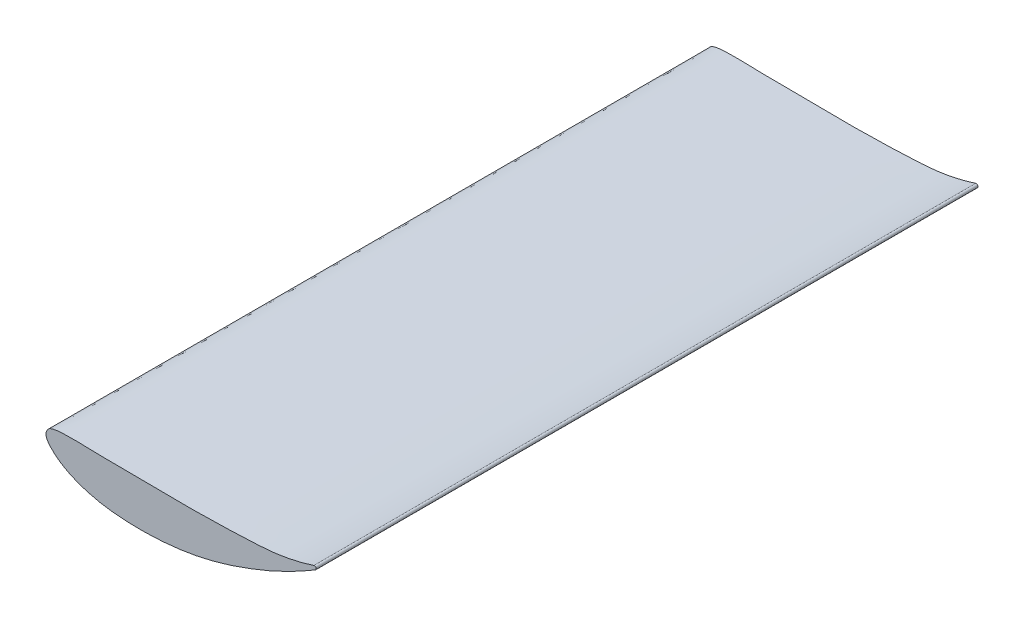
ISO-10303-21;
HEADER;
FILE_DESCRIPTION(('STEP AP214'),'2;1');
FILE_NAME('part.step','',(''),(''),'','','');
FILE_SCHEMA(('AUTOMOTIVE_DESIGN { 1 0 10303 214 1 1 1 1 }'));
ENDSEC;
DATA;
#1=APPLICATION_CONTEXT('core data for automotive mechanical design processes');
#2=APPLICATION_PROTOCOL_DEFINITION('international standard','automotive_design',2000,#1);
#3=PRODUCT_CONTEXT('',#1,'mechanical');
#4=PRODUCT('Part','Part','',(#3));
#5=PRODUCT_RELATED_PRODUCT_CATEGORY('part','',(#4));
#6=PRODUCT_DEFINITION_FORMATION('','',#4);
#7=PRODUCT_DEFINITION_CONTEXT('part definition',#1,'design');
#8=PRODUCT_DEFINITION('design','',#6,#7);
#9=PRODUCT_DEFINITION_SHAPE('','',#8);
#10=(LENGTH_UNIT() NAMED_UNIT(*) SI_UNIT(.MILLI.,.METRE.));
#11=(NAMED_UNIT(*) PLANE_ANGLE_UNIT() SI_UNIT($,.RADIAN.));
#12=(NAMED_UNIT(*) SI_UNIT($,.STERADIAN.) SOLID_ANGLE_UNIT());
#13=UNCERTAINTY_MEASURE_WITH_UNIT(LENGTH_MEASURE(1.E-05),#10,'distance_accuracy_value','');
#14=(GEOMETRIC_REPRESENTATION_CONTEXT(3) GLOBAL_UNCERTAINTY_ASSIGNED_CONTEXT((#13)) GLOBAL_UNIT_ASSIGNED_CONTEXT((#10,
#11,#12)) REPRESENTATION_CONTEXT('',''));
#15=CARTESIAN_POINT('',(0.,0.,0.));
#16=DIRECTION('',(0.,0.,1.));
#17=DIRECTION('',(1.,0.,0.));
#18=AXIS2_PLACEMENT_3D('',#15,#16,#17);
#19=CARTESIAN_POINT('',(441.90503658956,24.941772715321,-450.));
#20=DIRECTION('',(0.,0.,1.));
#21=DIRECTION('',(1.,0.,0.));
#22=AXIS2_PLACEMENT_3D('',#19,#20,#21);
#23=CYLINDRICAL_SURFACE('',#22,2.41324609299518);
#24=DIRECTION('',(0.,0.,1.));
#25=VECTOR('',#24,1.);
#26=CARTESIAN_POINT('',(441.121202429271,27.2241751151008,-450.));
#27=LINE('',#26,#25);
#28=CARTESIAN_POINT('',(441.121202429271,27.2241751151008,-450.));
#29=VERTEX_POINT('',#28);
#30=CARTESIAN_POINT('',(441.121202429271,27.2241751151008,450.));
#31=VERTEX_POINT('',#30);
#32=EDGE_CURVE('E38',#29,#31,#27,.T.);
#33=ORIENTED_EDGE('',*,*,#32,.T.);
#34=CARTESIAN_POINT('',(441.90503658956,24.941772715321,450.));
#35=DIRECTION('',(0.,0.,1.));
#36=DIRECTION('',(1.,0.,0.));
#37=AXIS2_PLACEMENT_3D('',#34,#35,#36);
#38=CIRCLE('',#37,2.41324609299518);
#39=CARTESIAN_POINT('',(442.688870749209,22.6593703153214,450.));
#40=VERTEX_POINT('',#39);
#41=EDGE_CURVE('E62',#31,#40,#38,.F.);
#42=ORIENTED_EDGE('',*,*,#41,.T.);
#43=DIRECTION('',(0.,0.,1.));
#44=VECTOR('',#43,1.);
#45=CARTESIAN_POINT('',(442.688870749209,22.6593703153214,-450.));
#46=LINE('',#45,#44);
#47=CARTESIAN_POINT('',(442.688870749209,22.6593703153214,-450.));
#48=VERTEX_POINT('',#47);
#49=EDGE_CURVE('E11',#48,#40,#46,.T.);
#50=ORIENTED_EDGE('',*,*,#49,.F.);
#51=CARTESIAN_POINT('',(441.90503658956,24.941772715321,-450.));
#52=DIRECTION('',(0.,0.,1.));
#53=DIRECTION('',(1.,0.,0.));
#54=AXIS2_PLACEMENT_3D('',#51,#52,#53);
#55=CIRCLE('',#54,2.41324609299518);
#56=EDGE_CURVE('E48',#29,#48,#55,.F.);
#57=ORIENTED_EDGE('',*,*,#56,.F.);
#58=EDGE_LOOP('',(#33,#42,#50,#57));
#59=FACE_BOUND('',#58,.T.);
#60=ADVANCED_FACE('F35',(#59),#23,.T.);
#61=CARTESIAN_POINT('',(441.121202429271,27.2241751151008,-450.));
#62=CARTESIAN_POINT('',(439.510228077279,26.6709261662904,-450.));
#63=CARTESIAN_POINT('',(426.426084073409,22.5459790653451,-450.));
#64=CARTESIAN_POINT('',(396.762494375201,15.3349741159728,-450.));
#65=CARTESIAN_POINT('',(357.264669076135,12.8317644154676,-450.));
#66=CARTESIAN_POINT('',(317.060904654015,11.3179629176237,-450.));
#67=CARTESIAN_POINT('',(276.947389630846,10.5072967300343,-450.));
#68=CARTESIAN_POINT('',(236.706569169276,10.6726330191291,-450.));
#69=CARTESIAN_POINT('',(196.466834557623,11.7193311432718,-450.));
#70=CARTESIAN_POINT('',(162.884284557709,11.0234503480969,-450.));
#71=CARTESIAN_POINT('',(136.052882272573,12.2419391251921,-450.));
#72=CARTESIAN_POINT('',(119.25580822582,12.3254783261735,-450.));
#73=CARTESIAN_POINT('',(105.857064552022,12.3861180839417,-450.));
#74=CARTESIAN_POINT('',(95.8161122829706,12.0228251187854,-450.));
#75=CARTESIAN_POINT('',(87.4841988132968,10.8855325359016,-450.));
#76=CARTESIAN_POINT('',(79.5902657040784,8.20475458252079,-450.));
#77=CARTESIAN_POINT('',(77.0847116641741,3.0635229519714,-450.));
#78=CARTESIAN_POINT('',(76.9837025081338,0.,-450.));
#79=CARTESIAN_POINT('',(76.8310042931201,-4.6312087414406,-450.));
#80=CARTESIAN_POINT('',(81.9433961951352,-11.1487133598023,-450.));
#81=CARTESIAN_POINT('',(90.1003518091526,-19.2158860599758,-450.));
#82=CARTESIAN_POINT('',(99.3347058266765,-25.7383591704959,-450.));
#83=CARTESIAN_POINT('',(110.20297604528,-31.5406664557752,-450.));
#84=CARTESIAN_POINT('',(124.136845872895,-37.3624369375987,-450.));
#85=CARTESIAN_POINT('',(141.436679463777,-42.468406604807,-450.));
#86=CARTESIAN_POINT('',(168.759453641372,-47.3083496761233,-450.));
#87=CARTESIAN_POINT('',(202.648153350068,-49.2121169501814,-450.));
#88=CARTESIAN_POINT('',(242.882591392992,-47.4131749955245,-450.));
#89=CARTESIAN_POINT('',(282.745502554471,-41.7804628921796,-450.));
#90=CARTESIAN_POINT('',(322.002478713248,-31.6959335140244,-450.));
#91=CARTESIAN_POINT('',(360.96504503743,-17.8201203050009,-450.));
#92=CARTESIAN_POINT('',(398.974347592554,-1.64237362496091,-450.));
#93=CARTESIAN_POINT('',(428.016959968534,13.9964473423367,-450.));
#94=CARTESIAN_POINT('',(440.765728537991,21.4886340739987,-450.));
#95=CARTESIAN_POINT('',(442.688870749209,22.6593703153214,-450.));
#96=B_SPLINE_CURVE_WITH_KNOTS('',3,(#61,#62,#63,#64,#65,#66,#67,#68,#69,#70,#71,#72,#73,#74,#75,
#76,#77,#78,#79,#80,#81,#82,#83,#84,#85,#86,#87,#88,#89,#90,#91,#92,#93,#94,#95),.UNSPECIFIED.,
.F.,.F.,(4,1,1,1,1,1,1,1,1,1,1,1,1,1,1,3,1,1,1,1,1,1,1,1,1,1,1,1,1,1,4),(0.559158735452872,
0.565818267718824,0.613605215970763,0.66104652637157,0.708588114627705,0.756202533954078,
0.803923893317845,0.851705120263898,0.899416199638553,0.923358593248864,0.947240764032753,
0.959163533763078,0.971043670213581,0.982921060041623,0.989132360009273,1.,1.0164288990528,
1.02576400466202,1.04171840149073,1.05608595517952,1.06963151939296,1.09535611794549,
1.12007752423055,1.16821737473319,1.21574369689456,1.26321139428939,1.31112918055236,
1.35985662440325,1.40954702414444,1.46067165005945,1.46948594004619),.UNSPECIFIED.);
#97=DIRECTION('',(0.,0.,1.));
#98=VECTOR('',#97,1.);
#99=SURFACE_OF_LINEAR_EXTRUSION('',#96,#98);
#100=ORIENTED_EDGE('',*,*,#49,.T.);
#101=CARTESIAN_POINT('',(441.121202429271,27.2241751151008,450.));
#102=CARTESIAN_POINT('',(439.510228077279,26.6709261662904,450.));
#103=CARTESIAN_POINT('',(426.426084073409,22.5459790653451,450.));
#104=CARTESIAN_POINT('',(396.762494375201,15.3349741159728,450.));
#105=CARTESIAN_POINT('',(357.264669076135,12.8317644154676,450.));
#106=CARTESIAN_POINT('',(317.060904654015,11.3179629176237,450.));
#107=CARTESIAN_POINT('',(276.947389630846,10.5072967300343,450.));
#108=CARTESIAN_POINT('',(236.706569169276,10.6726330191291,450.));
#109=CARTESIAN_POINT('',(196.466834557623,11.7193311432718,450.));
#110=CARTESIAN_POINT('',(162.884284557709,11.0234503480969,450.));
#111=CARTESIAN_POINT('',(136.052882272573,12.2419391251921,450.));
#112=CARTESIAN_POINT('',(119.25580822582,12.3254783261735,450.));
#113=CARTESIAN_POINT('',(105.857064552022,12.3861180839417,450.));
#114=CARTESIAN_POINT('',(95.8161122829706,12.0228251187854,450.));
#115=CARTESIAN_POINT('',(87.4841988132968,10.8855325359016,450.));
#116=CARTESIAN_POINT('',(79.5902657040784,8.20475458252079,450.));
#117=CARTESIAN_POINT('',(77.0847116641741,3.0635229519714,450.));
#118=CARTESIAN_POINT('',(76.9837025081338,0.,450.));
#119=CARTESIAN_POINT('',(76.8310042931201,-4.6312087414406,450.));
#120=CARTESIAN_POINT('',(81.9433961951352,-11.1487133598023,450.));
#121=CARTESIAN_POINT('',(90.1003518091526,-19.2158860599758,450.));
#122=CARTESIAN_POINT('',(99.3347058266765,-25.7383591704959,450.));
#123=CARTESIAN_POINT('',(110.20297604528,-31.5406664557752,450.));
#124=CARTESIAN_POINT('',(124.136845872895,-37.3624369375987,450.));
#125=CARTESIAN_POINT('',(141.436679463777,-42.468406604807,450.));
#126=CARTESIAN_POINT('',(168.759453641372,-47.3083496761233,450.));
#127=CARTESIAN_POINT('',(202.648153350068,-49.2121169501814,450.));
#128=CARTESIAN_POINT('',(242.882591392992,-47.4131749955245,450.));
#129=CARTESIAN_POINT('',(282.745502554471,-41.7804628921796,450.));
#130=CARTESIAN_POINT('',(322.002478713248,-31.6959335140244,450.));
#131=CARTESIAN_POINT('',(360.96504503743,-17.8201203050009,450.));
#132=CARTESIAN_POINT('',(398.974347592554,-1.64237362496091,450.));
#133=CARTESIAN_POINT('',(428.016959968534,13.9964473423367,450.));
#134=CARTESIAN_POINT('',(440.765728537991,21.4886340739987,450.));
#135=CARTESIAN_POINT('',(442.688870749209,22.6593703153214,450.));
#136=B_SPLINE_CURVE_WITH_KNOTS('',3,(#101,#102,#103,#104,#105,#106,#107,#108,#109,#110,#111,
#112,#113,#114,#115,#116,#117,#118,#119,#120,#121,#122,#123,#124,#125,#126,#127,#128,#129,#130,
#131,#132,#133,#134,#135),.UNSPECIFIED.,.F.,.F.,(4,1,1,1,1,1,1,1,1,1,1,1,1,1,1,3,1,1,1,1,1,1,1,
1,1,1,1,1,1,1,4),(0.559158735452872,0.565818267718824,0.613605215970763,0.66104652637157,
0.708588114627705,0.756202533954078,0.803923893317845,0.851705120263898,0.899416199638553,
0.923358593248864,0.947240764032753,0.959163533763078,0.971043670213581,0.982921060041623,
0.989132360009273,1.,1.0164288990528,1.02576400466202,1.04171840149073,1.05608595517952,
1.06963151939296,1.09535611794549,1.12007752423055,1.16821737473319,1.21574369689456,
1.26321139428939,1.31112918055236,1.35985662440325,1.40954702414444,1.46067165005945,
1.46948594004619),.UNSPECIFIED.);
#137=EDGE_CURVE('E65',#31,#40,#136,.T.);
#138=ORIENTED_EDGE('',*,*,#137,.F.);
#139=ORIENTED_EDGE('',*,*,#32,.F.);
#140=EDGE_CURVE('E63',#29,#48,#96,.T.);
#141=ORIENTED_EDGE('',*,*,#140,.T.);
#142=EDGE_LOOP('',(#100,#138,#139,#141));
#143=FACE_BOUND('',#142,.T.);
#144=ADVANCED_FACE('F66',(#143),#99,.T.);
#145=CARTESIAN_POINT('',(0.,0.,-450.));
#146=DIRECTION('',(0.,0.,1.));
#147=DIRECTION('',(1.,0.,0.));
#148=AXIS2_PLACEMENT_3D('',#145,#146,#147);
#149=PLANE('',#148);
#150=ORIENTED_EDGE('',*,*,#56,.T.);
#151=ORIENTED_EDGE('',*,*,#140,.F.);
#152=EDGE_LOOP('',(#150,#151));
#153=FACE_BOUND('',#152,.T.);
#154=ADVANCED_FACE('F86',(#153),#149,.F.);
#155=CARTESIAN_POINT('',(0.,0.,450.));
#156=DIRECTION('',(0.,0.,1.));
#157=DIRECTION('',(1.,0.,0.));
#158=AXIS2_PLACEMENT_3D('',#155,#156,#157);
#159=PLANE('',#158);
#160=ORIENTED_EDGE('',*,*,#41,.F.);
#161=ORIENTED_EDGE('',*,*,#137,.T.);
#162=EDGE_LOOP('',(#160,#161));
#163=FACE_BOUND('',#162,.T.);
#164=ADVANCED_FACE('F69',(#163),#159,.T.);
#165=CLOSED_SHELL('',(#60,#144,#154,#164));
#166=MANIFOLD_SOLID_BREP('B2',#165);
#167=ADVANCED_BREP_SHAPE_REPRESENTATION('',(#18,#166),#14);
#168=SHAPE_DEFINITION_REPRESENTATION(#9,#167);
ENDSEC;
END-ISO-10303-21;
